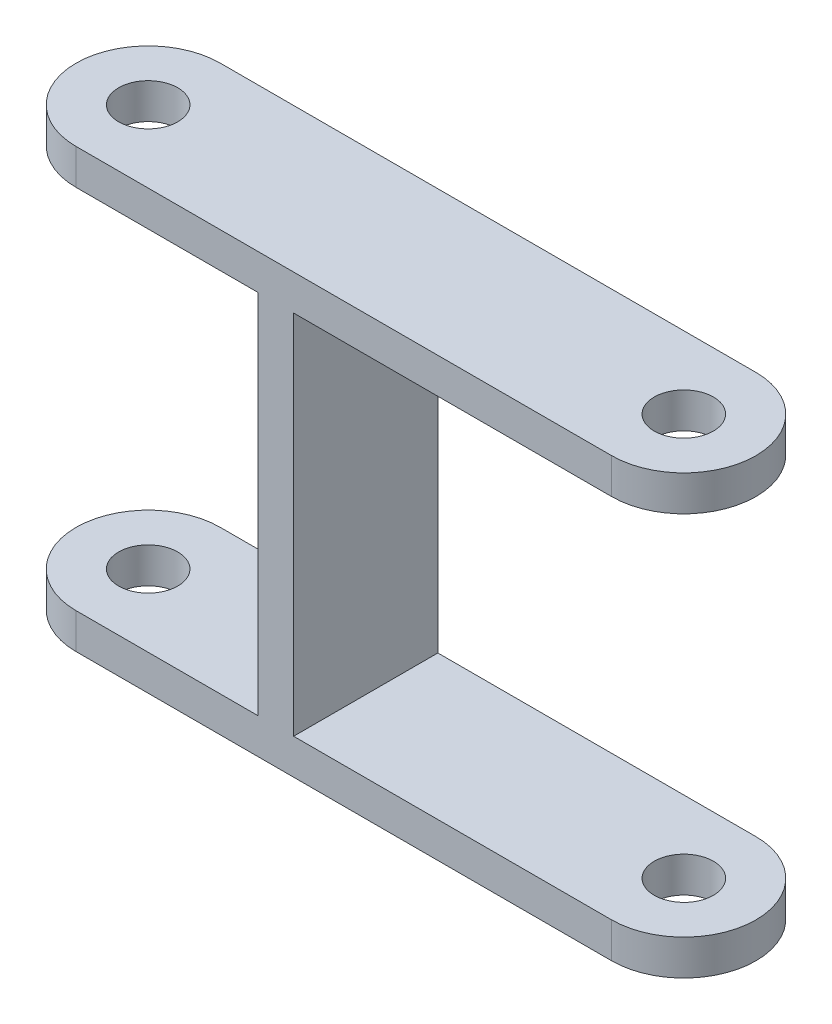
ISO-10303-21;
HEADER;
FILE_DESCRIPTION(('STEP AP214'),'2;1');
FILE_NAME('part.step','',(''),(''),'','','');
FILE_SCHEMA(('AUTOMOTIVE_DESIGN { 1 0 10303 214 1 1 1 1 }'));
ENDSEC;
DATA;
#1=APPLICATION_CONTEXT('core data for automotive mechanical design processes');
#2=APPLICATION_PROTOCOL_DEFINITION('international standard','automotive_design',2000,#1);
#3=PRODUCT_CONTEXT('',#1,'mechanical');
#4=PRODUCT('Part','Part','',(#3));
#5=PRODUCT_RELATED_PRODUCT_CATEGORY('part','',(#4));
#6=PRODUCT_DEFINITION_FORMATION('','',#4);
#7=PRODUCT_DEFINITION_CONTEXT('part definition',#1,'design');
#8=PRODUCT_DEFINITION('design','',#6,#7);
#9=PRODUCT_DEFINITION_SHAPE('','',#8);
#10=(LENGTH_UNIT() NAMED_UNIT(*) SI_UNIT(.MILLI.,.METRE.));
#11=(NAMED_UNIT(*) PLANE_ANGLE_UNIT() SI_UNIT($,.RADIAN.));
#12=(NAMED_UNIT(*) SI_UNIT($,.STERADIAN.) SOLID_ANGLE_UNIT());
#13=UNCERTAINTY_MEASURE_WITH_UNIT(LENGTH_MEASURE(1.E-05),#10,'distance_accuracy_value','');
#14=(GEOMETRIC_REPRESENTATION_CONTEXT(3) GLOBAL_UNCERTAINTY_ASSIGNED_CONTEXT((#13)) GLOBAL_UNIT_ASSIGNED_CONTEXT((#10,
#11,#12)) REPRESENTATION_CONTEXT('',''));
#15=CARTESIAN_POINT('',(0.,0.,0.));
#16=DIRECTION('',(0.,0.,1.));
#17=DIRECTION('',(1.,0.,0.));
#18=AXIS2_PLACEMENT_3D('',#15,#16,#17);
#19=CARTESIAN_POINT('',(13.7299374652974,37.,-49.1694514306871));
#20=DIRECTION('',(0.,-1.,0.));
#21=DIRECTION('',(0.,0.,-1.));
#22=AXIS2_PLACEMENT_3D('',#19,#20,#21);
#23=CYLINDRICAL_SURFACE('',#22,6.1);
#24=CARTESIAN_POINT('',(13.7299374652974,34.,-49.1694514306871));
#25=DIRECTION('',(0.,-1.,0.));
#26=DIRECTION('',(0.,0.,-1.));
#27=AXIS2_PLACEMENT_3D('',#24,#25,#26);
#28=CIRCLE('',#27,6.1);
#29=CARTESIAN_POINT('',(13.7299374652974,34.,-43.0694514306871));
#30=VERTEX_POINT('',#29);
#31=CARTESIAN_POINT('',(13.7299374652974,34.,-55.2694514306871));
#32=VERTEX_POINT('',#31);
#33=EDGE_CURVE('E212',#30,#32,#28,.T.);
#34=ORIENTED_EDGE('',*,*,#33,.F.);
#35=DIRECTION('',(0.,-1.,0.));
#36=VECTOR('',#35,1.);
#37=CARTESIAN_POINT('',(13.7299374652974,37.,-43.0694514306871));
#38=LINE('',#37,#36);
#39=CARTESIAN_POINT('',(13.7299374652974,37.,-43.0694514306871));
#40=VERTEX_POINT('',#39);
#41=EDGE_CURVE('E11',#40,#30,#38,.T.);
#42=ORIENTED_EDGE('',*,*,#41,.F.);
#43=CARTESIAN_POINT('',(13.7299374652974,37.,-49.1694514306871));
#44=DIRECTION('',(0.,1.,0.));
#45=DIRECTION('',(0.,0.,1.));
#46=AXIS2_PLACEMENT_3D('',#43,#44,#45);
#47=CIRCLE('',#46,6.1);
#48=CARTESIAN_POINT('',(13.7299374652974,37.,-55.2694514306871));
#49=VERTEX_POINT('',#48);
#50=EDGE_CURVE('E232',#49,#40,#47,.T.);
#51=ORIENTED_EDGE('',*,*,#50,.F.);
#52=DIRECTION('',(0.,-1.,0.));
#53=VECTOR('',#52,1.);
#54=CARTESIAN_POINT('',(13.7299374652974,37.,-55.2694514306871));
#55=LINE('',#54,#53);
#56=EDGE_CURVE('E261',#49,#32,#55,.T.);
#57=ORIENTED_EDGE('',*,*,#56,.T.);
#58=EDGE_LOOP('',(#34,#42,#51,#57));
#59=FACE_BOUND('',#58,.T.);
#60=ADVANCED_FACE('F45',(#59),#23,.T.);
#61=CARTESIAN_POINT('',(13.7299374652974,37.,-43.0694514306871));
#62=DIRECTION('',(0.,0.,-1.));
#63=DIRECTION('',(-1.,0.,0.));
#64=AXIS2_PLACEMENT_3D('',#61,#62,#63);
#65=PLANE('',#64);
#66=DIRECTION('',(-1.,0.,0.));
#67=VECTOR('',#66,1.);
#68=CARTESIAN_POINT('',(0.,34.,-43.0694514306871));
#69=LINE('',#68,#67);
#70=CARTESIAN_POINT('',(29.1299374652974,34.,-43.0694514306871));
#71=VERTEX_POINT('',#70);
#72=EDGE_CURVE('E139',#71,#30,#69,.T.);
#73=ORIENTED_EDGE('',*,*,#72,.F.);
#74=DIRECTION('',(0.,-1.,0.));
#75=VECTOR('',#74,1.);
#76=CARTESIAN_POINT('',(29.1299374652974,0.,-43.0694514306871));
#77=LINE('',#76,#75);
#78=CARTESIAN_POINT('',(29.1299374652974,3.,-43.0694514306871));
#79=VERTEX_POINT('',#78);
#80=EDGE_CURVE('E149',#71,#79,#77,.T.);
#81=ORIENTED_EDGE('',*,*,#80,.T.);
#82=DIRECTION('',(-1.,0.,0.));
#83=VECTOR('',#82,1.);
#84=CARTESIAN_POINT('',(0.,3.,-43.0694514306871));
#85=LINE('',#84,#83);
#86=CARTESIAN_POINT('',(13.7299374652974,3.,-43.0694514306871));
#87=VERTEX_POINT('',#86);
#88=EDGE_CURVE('E146',#79,#87,#85,.T.);
#89=ORIENTED_EDGE('',*,*,#88,.T.);
#90=CARTESIAN_POINT('',(13.7299374652974,0.,-43.0694514306871));
#91=VERTEX_POINT('',#90);
#92=EDGE_CURVE('E55',#87,#91,#38,.T.);
#93=ORIENTED_EDGE('',*,*,#92,.T.);
#94=DIRECTION('',(1.,0.,0.));
#95=VECTOR('',#94,1.);
#96=CARTESIAN_POINT('',(13.7299374652974,0.,-43.0694514306871));
#97=LINE('',#96,#95);
#98=CARTESIAN_POINT('',(59.0299374652974,0.,-43.0694514306871));
#99=VERTEX_POINT('',#98);
#100=EDGE_CURVE('E250',#91,#99,#97,.T.);
#101=ORIENTED_EDGE('',*,*,#100,.T.);
#102=DIRECTION('',(0.,-1.,0.));
#103=VECTOR('',#102,1.);
#104=CARTESIAN_POINT('',(59.0299374652974,37.,-43.0694514306871));
#105=LINE('',#104,#103);
#106=CARTESIAN_POINT('',(59.0299374652974,3.,-43.0694514306871));
#107=VERTEX_POINT('',#106);
#108=EDGE_CURVE('E270',#107,#99,#105,.T.);
#109=ORIENTED_EDGE('',*,*,#108,.F.);
#110=DIRECTION('',(1.,0.,0.));
#111=VECTOR('',#110,1.);
#112=CARTESIAN_POINT('',(32.1299374652974,3.,-43.0694514306871));
#113=LINE('',#112,#111);
#114=CARTESIAN_POINT('',(32.1299374652974,3.,-43.0694514306871));
#115=VERTEX_POINT('',#114);
#116=EDGE_CURVE('E186',#115,#107,#113,.T.);
#117=ORIENTED_EDGE('',*,*,#116,.F.);
#118=DIRECTION('',(0.,-1.,0.));
#119=VECTOR('',#118,1.);
#120=CARTESIAN_POINT('',(32.1299374652974,34.,-43.0694514306871));
#121=LINE('',#120,#119);
#122=CARTESIAN_POINT('',(32.1299374652974,34.,-43.0694514306871));
#123=VERTEX_POINT('',#122);
#124=EDGE_CURVE('E180',#123,#115,#121,.T.);
#125=ORIENTED_EDGE('',*,*,#124,.F.);
#126=DIRECTION('',(1.,0.,0.));
#127=VECTOR('',#126,1.);
#128=CARTESIAN_POINT('',(32.1299374652974,34.,-43.0694514306871));
#129=LINE('',#128,#127);
#130=CARTESIAN_POINT('',(59.0299374652974,34.,-43.0694514306871));
#131=VERTEX_POINT('',#130);
#132=EDGE_CURVE('E193',#123,#131,#129,.T.);
#133=ORIENTED_EDGE('',*,*,#132,.T.);
#134=CARTESIAN_POINT('',(59.0299374652974,37.,-43.0694514306871));
#135=VERTEX_POINT('',#134);
#136=EDGE_CURVE('E271',#135,#131,#105,.T.);
#137=ORIENTED_EDGE('',*,*,#136,.F.);
#138=DIRECTION('',(1.,0.,0.));
#139=VECTOR('',#138,1.);
#140=CARTESIAN_POINT('',(13.7299374652974,37.,-43.0694514306871));
#141=LINE('',#140,#139);
#142=EDGE_CURVE('E236',#40,#135,#141,.T.);
#143=ORIENTED_EDGE('',*,*,#142,.F.);
#144=ORIENTED_EDGE('',*,*,#41,.T.);
#145=EDGE_LOOP('',(#73,#81,#89,#93,#101,#109,#117,#125,#133,#137,#143,#144));
#146=FACE_BOUND('',#145,.T.);
#147=ADVANCED_FACE('F156',(#146),#65,.F.);
#148=CARTESIAN_POINT('',(59.0299374652974,37.,-49.1694514306871));
#149=DIRECTION('',(0.,-1.,0.));
#150=DIRECTION('',(0.,0.,-1.));
#151=AXIS2_PLACEMENT_3D('',#148,#149,#150);
#152=CYLINDRICAL_SURFACE('',#151,6.09999999999999);
#153=CARTESIAN_POINT('',(59.0299374652974,3.,-49.1694514306871));
#154=DIRECTION('',(0.,1.,0.));
#155=DIRECTION('',(-1.,0.,0.));
#156=AXIS2_PLACEMENT_3D('',#153,#154,#155);
#157=CIRCLE('',#156,6.09999999999999);
#158=CARTESIAN_POINT('',(59.0299374652974,3.,-55.2694514306871));
#159=VERTEX_POINT('',#158);
#160=EDGE_CURVE('E204',#107,#159,#157,.T.);
#161=ORIENTED_EDGE('',*,*,#160,.F.);
#162=ORIENTED_EDGE('',*,*,#108,.T.);
#163=CARTESIAN_POINT('',(59.0299374652974,0.,-49.1694514306871));
#164=DIRECTION('',(0.,1.,0.));
#165=DIRECTION('',(0.,0.,1.));
#166=AXIS2_PLACEMENT_3D('',#163,#164,#165);
#167=CIRCLE('',#166,6.09999999999999);
#168=CARTESIAN_POINT('',(59.0299374652974,0.,-55.2694514306871));
#169=VERTEX_POINT('',#168);
#170=EDGE_CURVE('E254',#99,#169,#167,.T.);
#171=ORIENTED_EDGE('',*,*,#170,.T.);
#172=DIRECTION('',(0.,-1.,0.));
#173=VECTOR('',#172,1.);
#174=CARTESIAN_POINT('',(59.0299374652974,37.,-55.2694514306871));
#175=LINE('',#174,#173);
#176=EDGE_CURVE('E265',#159,#169,#175,.T.);
#177=ORIENTED_EDGE('',*,*,#176,.F.);
#178=EDGE_LOOP('',(#161,#162,#171,#177));
#179=FACE_BOUND('',#178,.T.);
#180=ADVANCED_FACE('F323',(#179),#152,.T.);
#181=CARTESIAN_POINT('',(13.7299374652974,37.,-55.2694514306871));
#182=DIRECTION('',(0.,0.,1.));
#183=DIRECTION('',(1.,0.,0.));
#184=AXIS2_PLACEMENT_3D('',#181,#182,#183);
#185=PLANE('',#184);
#186=DIRECTION('',(-1.,0.,0.));
#187=VECTOR('',#186,1.);
#188=CARTESIAN_POINT('',(0.,34.,-55.2694514306871));
#189=LINE('',#188,#187);
#190=CARTESIAN_POINT('',(29.1299374652974,34.,-55.2694514306871));
#191=VERTEX_POINT('',#190);
#192=EDGE_CURVE('E63',#191,#32,#189,.T.);
#193=ORIENTED_EDGE('',*,*,#192,.T.);
#194=ORIENTED_EDGE('',*,*,#56,.F.);
#195=DIRECTION('',(-1.,0.,0.));
#196=VECTOR('',#195,1.);
#197=CARTESIAN_POINT('',(13.7299374652974,37.,-55.2694514306871));
#198=LINE('',#197,#196);
#199=CARTESIAN_POINT('',(59.0299374652974,37.,-55.2694514306871));
#200=VERTEX_POINT('',#199);
#201=EDGE_CURVE('E243',#200,#49,#198,.T.);
#202=ORIENTED_EDGE('',*,*,#201,.F.);
#203=CARTESIAN_POINT('',(59.0299374652974,34.,-55.2694514306871));
#204=VERTEX_POINT('',#203);
#205=EDGE_CURVE('E266',#200,#204,#175,.T.);
#206=ORIENTED_EDGE('',*,*,#205,.T.);
#207=DIRECTION('',(1.,0.,0.));
#208=VECTOR('',#207,1.);
#209=CARTESIAN_POINT('',(32.1299374652974,34.,-55.2694514306871));
#210=LINE('',#209,#208);
#211=CARTESIAN_POINT('',(32.1299374652974,34.,-55.2694514306871));
#212=VERTEX_POINT('',#211);
#213=EDGE_CURVE('E185',#212,#204,#210,.T.);
#214=ORIENTED_EDGE('',*,*,#213,.F.);
#215=DIRECTION('',(0.,-1.,0.));
#216=VECTOR('',#215,1.);
#217=CARTESIAN_POINT('',(32.1299374652974,34.,-55.2694514306871));
#218=LINE('',#217,#216);
#219=CARTESIAN_POINT('',(32.1299374652974,3.,-55.2694514306871));
#220=VERTEX_POINT('',#219);
#221=EDGE_CURVE('E181',#212,#220,#218,.T.);
#222=ORIENTED_EDGE('',*,*,#221,.T.);
#223=DIRECTION('',(1.,0.,0.));
#224=VECTOR('',#223,1.);
#225=CARTESIAN_POINT('',(32.1299374652974,3.,-55.2694514306871));
#226=LINE('',#225,#224);
#227=EDGE_CURVE('E71',#220,#159,#226,.T.);
#228=ORIENTED_EDGE('',*,*,#227,.T.);
#229=ORIENTED_EDGE('',*,*,#176,.T.);
#230=DIRECTION('',(-1.,0.,0.));
#231=VECTOR('',#230,1.);
#232=CARTESIAN_POINT('',(13.7299374652974,0.,-55.2694514306871));
#233=LINE('',#232,#231);
#234=CARTESIAN_POINT('',(13.7299374652974,0.,-55.2694514306871));
#235=VERTEX_POINT('',#234);
#236=EDGE_CURVE('E237',#169,#235,#233,.T.);
#237=ORIENTED_EDGE('',*,*,#236,.T.);
#238=CARTESIAN_POINT('',(13.7299374652974,3.,-55.2694514306871));
#239=VERTEX_POINT('',#238);
#240=EDGE_CURVE('E246',#239,#235,#55,.T.);
#241=ORIENTED_EDGE('',*,*,#240,.F.);
#242=DIRECTION('',(-1.,0.,0.));
#243=VECTOR('',#242,1.);
#244=CARTESIAN_POINT('',(0.,3.,-55.2694514306871));
#245=LINE('',#244,#243);
#246=CARTESIAN_POINT('',(29.1299374652974,3.,-55.2694514306871));
#247=VERTEX_POINT('',#246);
#248=EDGE_CURVE('E159',#247,#239,#245,.T.);
#249=ORIENTED_EDGE('',*,*,#248,.F.);
#250=DIRECTION('',(0.,-1.,0.));
#251=VECTOR('',#250,1.);
#252=CARTESIAN_POINT('',(29.1299374652974,0.,-55.2694514306871));
#253=LINE('',#252,#251);
#254=EDGE_CURVE('E162',#191,#247,#253,.T.);
#255=ORIENTED_EDGE('',*,*,#254,.F.);
#256=EDGE_LOOP('',(#193,#194,#202,#206,#214,#222,#228,#229,#237,#241,#249,#255));
#257=FACE_BOUND('',#256,.T.);
#258=ADVANCED_FACE('F320',(#257),#185,.F.);
#259=CARTESIAN_POINT('',(13.7299374652974,37.,-49.1694514306871));
#260=DIRECTION('',(0.,-1.,0.));
#261=DIRECTION('',(0.,0.,-1.));
#262=AXIS2_PLACEMENT_3D('',#259,#260,#261);
#263=CYLINDRICAL_SURFACE('',#262,2.5);
#264=CARTESIAN_POINT('',(13.7299374652974,37.,-49.1694514306871));
#265=DIRECTION('',(0.,1.,0.));
#266=DIRECTION('',(0.,0.,1.));
#267=AXIS2_PLACEMENT_3D('',#264,#265,#266);
#268=CIRCLE('',#267,2.5);
#269=CARTESIAN_POINT('',(13.7299374652974,37.,-46.6694514306871));
#270=VERTEX_POINT('',#269);
#271=EDGE_CURVE('E224',#270,#270,#268,.T.);
#272=ORIENTED_EDGE('',*,*,#271,.T.);
#273=EDGE_LOOP('',(#272));
#274=FACE_BOUND('',#273,.T.);
#275=CARTESIAN_POINT('',(13.7299374652974,34.,-49.1694514306871));
#276=DIRECTION('',(0.,-1.,0.));
#277=DIRECTION('',(0.,0.,-1.));
#278=AXIS2_PLACEMENT_3D('',#275,#276,#277);
#279=CIRCLE('',#278,2.5);
#280=CARTESIAN_POINT('',(13.7299374652974,34.,-51.6694514306871));
#281=VERTEX_POINT('',#280);
#282=EDGE_CURVE('E49',#281,#281,#279,.T.);
#283=ORIENTED_EDGE('',*,*,#282,.T.);
#284=EDGE_LOOP('',(#283));
#285=FACE_BOUND('',#284,.T.);
#286=ADVANCED_FACE('F293',(#274,#285),#263,.F.);
#287=CARTESIAN_POINT('',(59.0299374652974,37.,-49.1694514306871));
#288=DIRECTION('',(0.,-1.,0.));
#289=DIRECTION('',(0.,0.,-1.));
#290=AXIS2_PLACEMENT_3D('',#287,#288,#289);
#291=CYLINDRICAL_SURFACE('',#290,2.5);
#292=CARTESIAN_POINT('',(59.0299374652974,0.,-49.1694514306871));
#293=DIRECTION('',(0.,1.,0.));
#294=DIRECTION('',(0.,0.,1.));
#295=AXIS2_PLACEMENT_3D('',#292,#293,#294);
#296=CIRCLE('',#295,2.5);
#297=CARTESIAN_POINT('',(59.0299374652974,0.,-46.6694514306871));
#298=VERTEX_POINT('',#297);
#299=EDGE_CURVE('E215',#298,#298,#296,.T.);
#300=ORIENTED_EDGE('',*,*,#299,.F.);
#301=EDGE_LOOP('',(#300));
#302=FACE_BOUND('',#301,.T.);
#303=CARTESIAN_POINT('',(59.0299374652974,3.,-49.1694514306871));
#304=DIRECTION('',(0.,1.,0.));
#305=DIRECTION('',(-1.,0.,0.));
#306=AXIS2_PLACEMENT_3D('',#303,#304,#305);
#307=CIRCLE('',#306,2.5);
#308=CARTESIAN_POINT('',(56.5299374652974,3.,-49.1694514306871));
#309=VERTEX_POINT('',#308);
#310=EDGE_CURVE('E203',#309,#309,#307,.T.);
#311=ORIENTED_EDGE('',*,*,#310,.T.);
#312=EDGE_LOOP('',(#311));
#313=FACE_BOUND('',#312,.T.);
#314=ADVANCED_FACE('F304',(#302,#313),#291,.F.);
#315=CARTESIAN_POINT('',(13.7299374652974,37.,-49.1694514306871));
#316=DIRECTION('',(0.,1.,0.));
#317=DIRECTION('',(0.,0.,1.));
#318=AXIS2_PLACEMENT_3D('',#315,#316,#317);
#319=PLANE('',#318);
#320=ORIENTED_EDGE('',*,*,#271,.F.);
#321=EDGE_LOOP('',(#320));
#322=FACE_BOUND('',#321,.T.);
#323=ORIENTED_EDGE('',*,*,#50,.T.);
#324=ORIENTED_EDGE('',*,*,#142,.T.);
#325=CARTESIAN_POINT('',(59.0299374652974,37.,-49.1694514306871));
#326=DIRECTION('',(0.,1.,0.));
#327=DIRECTION('',(0.,0.,1.));
#328=AXIS2_PLACEMENT_3D('',#325,#326,#327);
#329=CIRCLE('',#328,6.09999999999999);
#330=EDGE_CURVE('E240',#135,#200,#329,.T.);
#331=ORIENTED_EDGE('',*,*,#330,.T.);
#332=ORIENTED_EDGE('',*,*,#201,.T.);
#333=EDGE_LOOP('',(#323,#324,#331,#332));
#334=FACE_BOUND('',#333,.T.);
#335=CARTESIAN_POINT('',(59.0299374652974,37.,-49.1694514306871));
#336=DIRECTION('',(0.,1.,0.));
#337=DIRECTION('',(0.,0.,1.));
#338=AXIS2_PLACEMENT_3D('',#335,#336,#337);
#339=CIRCLE('',#338,2.5);
#340=CARTESIAN_POINT('',(59.0299374652974,37.,-46.6694514306871));
#341=VERTEX_POINT('',#340);
#342=EDGE_CURVE('E216',#341,#341,#339,.T.);
#343=ORIENTED_EDGE('',*,*,#342,.F.);
#344=EDGE_LOOP('',(#343));
#345=FACE_BOUND('',#344,.T.);
#346=ADVANCED_FACE('F299',(#322,#334,#345),#319,.T.);
#347=CARTESIAN_POINT('',(13.7299374652974,0.,-49.1694514306871));
#348=DIRECTION('',(0.,1.,0.));
#349=DIRECTION('',(0.,0.,1.));
#350=AXIS2_PLACEMENT_3D('',#347,#348,#349);
#351=PLANE('',#350);
#352=CARTESIAN_POINT('',(13.7299374652974,0.,-49.1694514306871));
#353=DIRECTION('',(0.,1.,0.));
#354=DIRECTION('',(0.,0.,1.));
#355=AXIS2_PLACEMENT_3D('',#352,#353,#354);
#356=CIRCLE('',#355,6.1);
#357=EDGE_CURVE('E228',#235,#91,#356,.T.);
#358=ORIENTED_EDGE('',*,*,#357,.F.);
#359=ORIENTED_EDGE('',*,*,#236,.F.);
#360=ORIENTED_EDGE('',*,*,#170,.F.);
#361=ORIENTED_EDGE('',*,*,#100,.F.);
#362=EDGE_LOOP('',(#358,#359,#360,#361));
#363=FACE_BOUND('',#362,.T.);
#364=CARTESIAN_POINT('',(13.7299374652974,0.,-49.1694514306871));
#365=DIRECTION('',(0.,1.,0.));
#366=DIRECTION('',(0.,0.,1.));
#367=AXIS2_PLACEMENT_3D('',#364,#365,#366);
#368=CIRCLE('',#367,2.5);
#369=CARTESIAN_POINT('',(13.7299374652974,0.,-46.6694514306871));
#370=VERTEX_POINT('',#369);
#371=EDGE_CURVE('E220',#370,#370,#368,.T.);
#372=ORIENTED_EDGE('',*,*,#371,.T.);
#373=EDGE_LOOP('',(#372));
#374=FACE_BOUND('',#373,.T.);
#375=ORIENTED_EDGE('',*,*,#299,.T.);
#376=EDGE_LOOP('',(#375));
#377=FACE_BOUND('',#376,.T.);
#378=ADVANCED_FACE('F296',(#363,#374,#377),#351,.F.);
#379=ORIENTED_EDGE('',*,*,#92,.F.);
#380=CARTESIAN_POINT('',(13.7299374652974,3.,-49.1694514306871));
#381=DIRECTION('',(0.,-1.,0.));
#382=DIRECTION('',(1.,0.,0.));
#383=AXIS2_PLACEMENT_3D('',#380,#381,#382);
#384=CIRCLE('',#383,6.1);
#385=EDGE_CURVE('E208',#87,#239,#384,.T.);
#386=ORIENTED_EDGE('',*,*,#385,.T.);
#387=ORIENTED_EDGE('',*,*,#240,.T.);
#388=ORIENTED_EDGE('',*,*,#357,.T.);
#389=EDGE_LOOP('',(#379,#386,#387,#388));
#390=FACE_BOUND('',#389,.T.);
#391=ADVANCED_FACE('F47',(#390),#23,.T.);
#392=ORIENTED_EDGE('',*,*,#136,.T.);
#393=CARTESIAN_POINT('',(59.0299374652974,34.,-49.1694514306871));
#394=DIRECTION('',(0.,1.,0.));
#395=DIRECTION('',(-1.,0.,0.));
#396=AXIS2_PLACEMENT_3D('',#393,#394,#395);
#397=CIRCLE('',#396,6.09999999999999);
#398=EDGE_CURVE('E199',#131,#204,#397,.T.);
#399=ORIENTED_EDGE('',*,*,#398,.T.);
#400=ORIENTED_EDGE('',*,*,#205,.F.);
#401=ORIENTED_EDGE('',*,*,#330,.F.);
#402=EDGE_LOOP('',(#392,#399,#400,#401));
#403=FACE_BOUND('',#402,.T.);
#404=ADVANCED_FACE('F291',(#403),#152,.T.);
#405=CARTESIAN_POINT('',(13.7299374652974,3.,-49.1694514306871));
#406=DIRECTION('',(0.,-1.,0.));
#407=DIRECTION('',(1.,0.,0.));
#408=AXIS2_PLACEMENT_3D('',#405,#406,#407);
#409=CIRCLE('',#408,2.5);
#410=CARTESIAN_POINT('',(16.2299374652974,3.,-49.1694514306871));
#411=VERTEX_POINT('',#410);
#412=EDGE_CURVE('E207',#411,#411,#409,.T.);
#413=ORIENTED_EDGE('',*,*,#412,.F.);
#414=EDGE_LOOP('',(#413));
#415=FACE_BOUND('',#414,.T.);
#416=ORIENTED_EDGE('',*,*,#371,.F.);
#417=EDGE_LOOP('',(#416));
#418=FACE_BOUND('',#417,.T.);
#419=ADVANCED_FACE('F287',(#415,#418),#263,.F.);
#420=CARTESIAN_POINT('',(59.0299374652974,34.,-49.1694514306871));
#421=DIRECTION('',(0.,1.,0.));
#422=DIRECTION('',(-1.,0.,0.));
#423=AXIS2_PLACEMENT_3D('',#420,#421,#422);
#424=CIRCLE('',#423,2.5);
#425=CARTESIAN_POINT('',(56.5299374652974,34.,-49.1694514306871));
#426=VERTEX_POINT('',#425);
#427=EDGE_CURVE('E172',#426,#426,#424,.T.);
#428=ORIENTED_EDGE('',*,*,#427,.F.);
#429=EDGE_LOOP('',(#428));
#430=FACE_BOUND('',#429,.T.);
#431=ORIENTED_EDGE('',*,*,#342,.T.);
#432=EDGE_LOOP('',(#431));
#433=FACE_BOUND('',#432,.T.);
#434=ADVANCED_FACE('F290',(#430,#433),#291,.F.);
#435=CARTESIAN_POINT('',(32.1299374652974,3.,-43.0694514306871));
#436=DIRECTION('',(0.,1.,0.));
#437=DIRECTION('',(-1.,0.,0.));
#438=AXIS2_PLACEMENT_3D('',#435,#436,#437);
#439=PLANE('',#438);
#440=ORIENTED_EDGE('',*,*,#310,.F.);
#441=EDGE_LOOP('',(#440));
#442=FACE_BOUND('',#441,.T.);
#443=ORIENTED_EDGE('',*,*,#160,.T.);
#444=ORIENTED_EDGE('',*,*,#227,.F.);
#445=DIRECTION('',(0.,0.,-1.));
#446=VECTOR('',#445,1.);
#447=CARTESIAN_POINT('',(32.1299374652974,3.,-43.0694514306871));
#448=LINE('',#447,#446);
#449=EDGE_CURVE('E177',#115,#220,#448,.T.);
#450=ORIENTED_EDGE('',*,*,#449,.F.);
#451=ORIENTED_EDGE('',*,*,#116,.T.);
#452=EDGE_LOOP('',(#443,#444,#450,#451));
#453=FACE_BOUND('',#452,.T.);
#454=ADVANCED_FACE('F310',(#442,#453),#439,.T.);
#455=CARTESIAN_POINT('',(32.1299374652974,34.,-43.0694514306871));
#456=DIRECTION('',(0.,1.,0.));
#457=DIRECTION('',(-1.,0.,0.));
#458=AXIS2_PLACEMENT_3D('',#455,#456,#457);
#459=PLANE('',#458);
#460=ORIENTED_EDGE('',*,*,#427,.T.);
#461=EDGE_LOOP('',(#460));
#462=FACE_BOUND('',#461,.T.);
#463=ORIENTED_EDGE('',*,*,#132,.F.);
#464=DIRECTION('',(0.,0.,-1.));
#465=VECTOR('',#464,1.);
#466=CARTESIAN_POINT('',(32.1299374652974,34.,-43.0694514306871));
#467=LINE('',#466,#465);
#468=EDGE_CURVE('E174',#123,#212,#467,.T.);
#469=ORIENTED_EDGE('',*,*,#468,.T.);
#470=ORIENTED_EDGE('',*,*,#213,.T.);
#471=ORIENTED_EDGE('',*,*,#398,.F.);
#472=EDGE_LOOP('',(#463,#469,#470,#471));
#473=FACE_BOUND('',#472,.T.);
#474=ADVANCED_FACE('F312',(#462,#473),#459,.F.);
#475=CARTESIAN_POINT('',(32.1299374652974,34.,-43.0694514306871));
#476=DIRECTION('',(1.,0.,0.));
#477=DIRECTION('',(0.,0.,-1.));
#478=AXIS2_PLACEMENT_3D('',#475,#476,#477);
#479=PLANE('',#478);
#480=ORIENTED_EDGE('',*,*,#221,.F.);
#481=ORIENTED_EDGE('',*,*,#468,.F.);
#482=ORIENTED_EDGE('',*,*,#124,.T.);
#483=ORIENTED_EDGE('',*,*,#449,.T.);
#484=EDGE_LOOP('',(#480,#481,#482,#483));
#485=FACE_BOUND('',#484,.T.);
#486=ADVANCED_FACE('F335',(#485),#479,.T.);
#487=CARTESIAN_POINT('',(0.,34.,-43.0694514306871));
#488=DIRECTION('',(0.,-1.,0.));
#489=DIRECTION('',(0.,0.,-1.));
#490=AXIS2_PLACEMENT_3D('',#487,#488,#489);
#491=PLANE('',#490);
#492=ORIENTED_EDGE('',*,*,#282,.F.);
#493=EDGE_LOOP('',(#492));
#494=FACE_BOUND('',#493,.T.);
#495=ORIENTED_EDGE('',*,*,#33,.T.);
#496=ORIENTED_EDGE('',*,*,#192,.F.);
#497=DIRECTION('',(0.,0.,-1.));
#498=VECTOR('',#497,1.);
#499=CARTESIAN_POINT('',(29.1299374652974,34.,-43.0694514306871));
#500=LINE('',#499,#498);
#501=EDGE_CURVE('E135',#71,#191,#500,.T.);
#502=ORIENTED_EDGE('',*,*,#501,.F.);
#503=ORIENTED_EDGE('',*,*,#72,.T.);
#504=EDGE_LOOP('',(#495,#496,#502,#503));
#505=FACE_BOUND('',#504,.T.);
#506=ADVANCED_FACE('F137',(#494,#505),#491,.T.);
#507=CARTESIAN_POINT('',(0.,3.,-43.0694514306871));
#508=DIRECTION('',(0.,-1.,0.));
#509=DIRECTION('',(1.,0.,0.));
#510=AXIS2_PLACEMENT_3D('',#507,#508,#509);
#511=PLANE('',#510);
#512=ORIENTED_EDGE('',*,*,#412,.T.);
#513=EDGE_LOOP('',(#512));
#514=FACE_BOUND('',#513,.T.);
#515=ORIENTED_EDGE('',*,*,#88,.F.);
#516=DIRECTION('',(0.,0.,-1.));
#517=VECTOR('',#516,1.);
#518=CARTESIAN_POINT('',(29.1299374652974,3.,-43.0694514306871));
#519=LINE('',#518,#517);
#520=EDGE_CURVE('E145',#79,#247,#519,.T.);
#521=ORIENTED_EDGE('',*,*,#520,.T.);
#522=ORIENTED_EDGE('',*,*,#248,.T.);
#523=ORIENTED_EDGE('',*,*,#385,.F.);
#524=EDGE_LOOP('',(#515,#521,#522,#523));
#525=FACE_BOUND('',#524,.T.);
#526=ADVANCED_FACE('F284',(#514,#525),#511,.F.);
#527=CARTESIAN_POINT('',(29.1299374652974,0.,-43.0694514306871));
#528=DIRECTION('',(1.,0.,0.));
#529=DIRECTION('',(0.,1.,0.));
#530=AXIS2_PLACEMENT_3D('',#527,#528,#529);
#531=PLANE('',#530);
#532=ORIENTED_EDGE('',*,*,#254,.T.);
#533=ORIENTED_EDGE('',*,*,#520,.F.);
#534=ORIENTED_EDGE('',*,*,#80,.F.);
#535=ORIENTED_EDGE('',*,*,#501,.T.);
#536=EDGE_LOOP('',(#532,#533,#534,#535));
#537=FACE_BOUND('',#536,.T.);
#538=ADVANCED_FACE('F150',(#537),#531,.F.);
#539=CLOSED_SHELL('',(#60,#147,#180,#258,#286,#314,#346,#378,#391,#404,#419,#434,#454,#474,#486,
#506,#526,#538));
#540=MANIFOLD_SOLID_BREP('B2',#539);
#541=ADVANCED_BREP_SHAPE_REPRESENTATION('',(#18,#540),#14);
#542=SHAPE_DEFINITION_REPRESENTATION(#9,#541);
ENDSEC;
END-ISO-10303-21;
